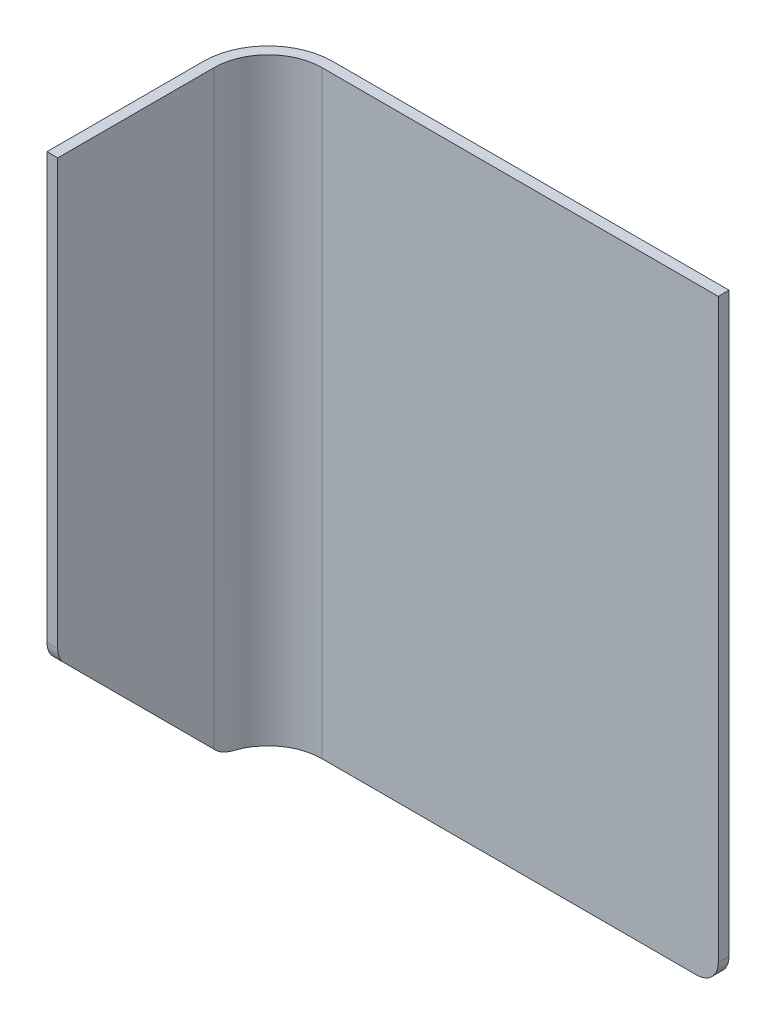
ISO-10303-21;
HEADER;
FILE_DESCRIPTION(('STEP AP214'),'2;1');
FILE_NAME('part.step','',(''),(''),'','','');
FILE_SCHEMA(('AUTOMOTIVE_DESIGN { 1 0 10303 214 1 1 1 1 }'));
ENDSEC;
DATA;
#1=APPLICATION_CONTEXT('core data for automotive mechanical design processes');
#2=APPLICATION_PROTOCOL_DEFINITION('international standard','automotive_design',2000,#1);
#3=PRODUCT_CONTEXT('',#1,'mechanical');
#4=PRODUCT('Part','Part','',(#3));
#5=PRODUCT_RELATED_PRODUCT_CATEGORY('part','',(#4));
#6=PRODUCT_DEFINITION_FORMATION('','',#4);
#7=PRODUCT_DEFINITION_CONTEXT('part definition',#1,'design');
#8=PRODUCT_DEFINITION('design','',#6,#7);
#9=PRODUCT_DEFINITION_SHAPE('','',#8);
#10=(LENGTH_UNIT() NAMED_UNIT(*) SI_UNIT(.MILLI.,.METRE.));
#11=(NAMED_UNIT(*) PLANE_ANGLE_UNIT() SI_UNIT($,.RADIAN.));
#12=(NAMED_UNIT(*) SI_UNIT($,.STERADIAN.) SOLID_ANGLE_UNIT());
#13=UNCERTAINTY_MEASURE_WITH_UNIT(LENGTH_MEASURE(1.E-05),#10,'distance_accuracy_value','');
#14=(GEOMETRIC_REPRESENTATION_CONTEXT(3) GLOBAL_UNCERTAINTY_ASSIGNED_CONTEXT((#13)) GLOBAL_UNIT_ASSIGNED_CONTEXT((#10,
#11,#12)) REPRESENTATION_CONTEXT('',''));
#15=CARTESIAN_POINT('',(0.,0.,0.));
#16=DIRECTION('',(0.,0.,1.));
#17=DIRECTION('',(1.,0.,0.));
#18=AXIS2_PLACEMENT_3D('',#15,#16,#17);
#19=CARTESIAN_POINT('',(-41.6247544353757,-111.,20.0738724011705));
#20=DIRECTION('',(0.,0.,1.));
#21=DIRECTION('',(1.,0.,0.));
#22=AXIS2_PLACEMENT_3D('',#19,#20,#21);
#23=PLANE('',#22);
#24=DIRECTION('',(0.,1.,0.));
#25=VECTOR('',#24,1.);
#26=CARTESIAN_POINT('',(-41.6247544353757,-111.,20.0738724011705));
#27=LINE('',#26,#25);
#28=CARTESIAN_POINT('',(-41.6247544353757,-78.8331457505076,20.0738724011705));
#29=VERTEX_POINT('',#28);
#30=CARTESIAN_POINT('',(-41.6247544353757,0.,20.0738724011705));
#31=VERTEX_POINT('',#30);
#32=EDGE_CURVE('E161',#29,#31,#27,.T.);
#33=ORIENTED_EDGE('',*,*,#32,.F.);
#34=DIRECTION('',(1.,0.,0.));
#35=VECTOR('',#34,1.);
#36=CARTESIAN_POINT('',(-41.6247544353757,-78.8331457505076,20.0738724011705));
#37=LINE('',#36,#35);
#38=CARTESIAN_POINT('',(-39.6247544353757,-78.8331457505076,20.0738724011705));
#39=VERTEX_POINT('',#38);
#40=EDGE_CURVE('E210',#29,#39,#37,.T.);
#41=ORIENTED_EDGE('',*,*,#40,.T.);
#42=DIRECTION('',(0.,1.,0.));
#43=VECTOR('',#42,1.);
#44=CARTESIAN_POINT('',(-39.6247544353757,-111.,20.0738724011705));
#45=LINE('',#44,#43);
#46=CARTESIAN_POINT('',(-39.6247544353757,0.,20.0738724011705));
#47=VERTEX_POINT('',#46);
#48=EDGE_CURVE('E176',#39,#47,#45,.T.);
#49=ORIENTED_EDGE('',*,*,#48,.T.);
#50=DIRECTION('',(1.,0.,0.));
#51=VECTOR('',#50,1.);
#52=CARTESIAN_POINT('',(-41.6247544353757,0.,20.0738724011705));
#53=LINE('',#52,#51);
#54=EDGE_CURVE('E155',#31,#47,#53,.T.);
#55=ORIENTED_EDGE('',*,*,#54,.F.);
#56=EDGE_LOOP('',(#33,#41,#49,#55));
#57=FACE_BOUND('',#56,.T.);
#58=ADVANCED_FACE('F45',(#57),#23,.T.);
#59=CARTESIAN_POINT('',(-41.6247544353757,-111.,-8.92612759882961));
#60=DIRECTION('',(-1.,0.,0.));
#61=DIRECTION('',(0.,0.,1.));
#62=AXIS2_PLACEMENT_3D('',#59,#60,#61);
#63=PLANE('',#62);
#64=DIRECTION('',(0.,0.707106781186545,0.70710678118655));
#65=VECTOR('',#64,1.);
#66=CARTESIAN_POINT('',(-41.6247544353757,-110.245,-9.68112759882964));
#67=LINE('',#66,#65);
#68=CARTESIAN_POINT('',(-41.6247544353757,-109.49,-8.92612759882961));
#69=VERTEX_POINT('',#68);
#70=CARTESIAN_POINT('',(-41.6247544353757,-81.6615728752538,18.9022995259167));
#71=VERTEX_POINT('',#70);
#72=EDGE_CURVE('E145',#69,#71,#67,.T.);
#73=ORIENTED_EDGE('',*,*,#72,.T.);
#74=CARTESIAN_POINT('',(-41.6247544353757,-78.8331457505076,16.0738724011705));
#75=DIRECTION('',(-1.,0.,0.));
#76=DIRECTION('',(0.,0.,1.));
#77=AXIS2_PLACEMENT_3D('',#74,#75,#76);
#78=CIRCLE('',#77,4.);
#79=EDGE_CURVE('E248',#71,#29,#78,.T.);
#80=ORIENTED_EDGE('',*,*,#79,.T.);
#81=ORIENTED_EDGE('',*,*,#32,.T.);
#82=DIRECTION('',(0.,0.,1.));
#83=VECTOR('',#82,1.);
#84=CARTESIAN_POINT('',(-41.6247544353757,0.,-8.92612759882961));
#85=LINE('',#84,#83);
#86=CARTESIAN_POINT('',(-41.6247544353757,0.,-8.92612759882961));
#87=VERTEX_POINT('',#86);
#88=EDGE_CURVE('E160',#87,#31,#85,.T.);
#89=ORIENTED_EDGE('',*,*,#88,.F.);
#90=DIRECTION('',(0.,1.,0.));
#91=VECTOR('',#90,1.);
#92=CARTESIAN_POINT('',(-41.6247544353757,-111.,-8.92612759882961));
#93=LINE('',#92,#91);
#94=EDGE_CURVE('E138',#69,#87,#93,.T.);
#95=ORIENTED_EDGE('',*,*,#94,.F.);
#96=EDGE_LOOP('',(#73,#80,#81,#89,#95));
#97=FACE_BOUND('',#96,.T.);
#98=ADVANCED_FACE('F158',(#97),#63,.T.);
#99=CARTESIAN_POINT('',(-29.6247544353757,-111.,-8.92612759882969));
#100=DIRECTION('',(0.,1.,0.));
#101=DIRECTION('',(0.,0.,1.));
#102=AXIS2_PLACEMENT_3D('',#99,#100,#101);
#103=CYLINDRICAL_SURFACE('',#102,12.);
#104=CARTESIAN_POINT('',(-29.6247544353757,-111.,-8.92612759882969));
#105=DIRECTION('',(0.,1.,0.));
#106=DIRECTION('',(0.,0.,-1.));
#107=AXIS2_PLACEMENT_3D('',#104,#105,#106);
#108=CIRCLE('',#107,12.);
#109=CARTESIAN_POINT('',(-29.6247544353756,-111.,-20.9261275988297));
#110=VERTEX_POINT('',#109);
#111=CARTESIAN_POINT('',(-41.1993401369234,-111.,-12.092981848322));
#112=VERTEX_POINT('',#111);
#113=EDGE_CURVE('E178',#110,#112,#108,.T.);
#114=ORIENTED_EDGE('',*,*,#113,.T.);
#115=CARTESIAN_POINT('',(-41.1993401369234,-111.,-12.092981848322));
#116=CARTESIAN_POINT('',(-41.2282799753824,-111.00001372111,-11.9872615264532));
#117=CARTESIAN_POINT('',(-41.2557481150244,-110.995808945441,-11.8811265743544));
#118=CARTESIAN_POINT('',(-41.3076374854076,-110.978864870066,-11.668773031291));
#119=CARTESIAN_POINT('',(-41.3320581278192,-110.966123925438,-11.562554428148));
#120=CARTESIAN_POINT('',(-41.3777403307654,-110.932007976302,-11.350808598872));
#121=CARTESIAN_POINT('',(-41.399001534314,-110.91063199713,-11.2452814521526));
#122=CARTESIAN_POINT('',(-41.4383411267961,-110.859261790802,-11.0357542865077));
#123=CARTESIAN_POINT('',(-41.4564198857218,-110.829268566558,-10.9317540913484));
#124=CARTESIAN_POINT('',(-41.4894801216575,-110.760701232352,-10.725898213813));
#125=CARTESIAN_POINT('',(-41.504455846915,-110.722111457739,-10.6240468226912));
#126=CARTESIAN_POINT('',(-41.531395812914,-110.636580513832,-10.423501275668));
#127=CARTESIAN_POINT('',(-41.5433600615644,-110.589639366472,-10.3248071114754));
#128=CARTESIAN_POINT('',(-41.5644566853485,-110.487771614103,-10.131511315448));
#129=CARTESIAN_POINT('',(-41.5735933614537,-110.432857325712,-10.0369036582086));
#130=CARTESIAN_POINT('',(-41.5893105059684,-110.315376236281,-9.85239344731122));
#131=CARTESIAN_POINT('',(-41.595892040973,-110.25281264267,-9.76248894400074));
#132=CARTESIAN_POINT('',(-41.6058779905045,-110.131689335304,-9.60284411934305));
#133=CARTESIAN_POINT('',(-41.6096319986706,-110.07425136263,-9.53227070650089));
#134=CARTESIAN_POINT('',(-41.6157770091754,-109.954750121988,-9.3952577587262));
#135=CARTESIAN_POINT('',(-41.6181698234536,-109.892693127685,-9.32881283371053));
#136=CARTESIAN_POINT('',(-41.6199812811355,-109.828427124746,-9.26455472357586));
#137=B_SPLINE_CURVE_WITH_KNOTS('',3,(#115,#116,#117,#118,#119,#120,#121,#122,#123,#124,#125,
#126,#127,#128,#129,#130,#131,#132,#133,#134,#135,#136),.UNSPECIFIED.,.F.,.F.,(4,2,2,2,2,2,2,2,
2,2,4),(0.,0.328754857572508,0.657573084517313,0.986428436538706,1.31524553042979,
1.64466676915633,1.97408714271983,2.30300394950849,2.63178330821751,2.90477859024877,
3.17740962189189),.UNSPECIFIED.);
#138=CARTESIAN_POINT('',(-41.6199812811355,-109.828427124746,-9.26455472357586));
#139=VERTEX_POINT('',#138);
#140=EDGE_CURVE('E141',#112,#139,#137,.T.);
#141=ORIENTED_EDGE('',*,*,#140,.T.);
#142=CARTESIAN_POINT('',(-29.6247544353757,-109.49,-8.92612759882969));
#143=DIRECTION('',(0.,-0.70710678118655,0.707106781186545));
#144=DIRECTION('',(0.,0.707106781186545,0.70710678118655));
#145=AXIS2_PLACEMENT_3D('',#142,#143,#144);
#146=ELLIPSE('',#145,16.9705627484771,12.);
#147=EDGE_CURVE('E132',#139,#69,#146,.F.);
#148=ORIENTED_EDGE('',*,*,#147,.T.);
#149=ORIENTED_EDGE('',*,*,#94,.T.);
#150=CARTESIAN_POINT('',(-29.6247544353757,0.,-8.92612759882969));
#151=DIRECTION('',(0.,1.,0.));
#152=DIRECTION('',(0.,0.,-1.));
#153=AXIS2_PLACEMENT_3D('',#150,#151,#152);
#154=CIRCLE('',#153,12.);
#155=CARTESIAN_POINT('',(-29.6247544353756,0.,-20.9261275988297));
#156=VERTEX_POINT('',#155);
#157=EDGE_CURVE('E294',#156,#87,#154,.T.);
#158=ORIENTED_EDGE('',*,*,#157,.F.);
#159=DIRECTION('',(0.,1.,0.));
#160=VECTOR('',#159,1.);
#161=CARTESIAN_POINT('',(-29.6247544353756,-111.,-20.9261275988297));
#162=LINE('',#161,#160);
#163=EDGE_CURVE('E162',#110,#156,#162,.T.);
#164=ORIENTED_EDGE('',*,*,#163,.F.);
#165=EDGE_LOOP('',(#114,#141,#148,#149,#158,#164));
#166=FACE_BOUND('',#165,.T.);
#167=ADVANCED_FACE('F135',(#166),#103,.T.);
#168=CARTESIAN_POINT('',(-29.6247544353757,-111.,-8.9261275988295));
#169=DIRECTION('',(0.,1.,0.));
#170=DIRECTION('',(0.,0.,1.));
#171=AXIS2_PLACEMENT_3D('',#168,#169,#170);
#172=CYLINDRICAL_SURFACE('',#171,10.);
#173=CARTESIAN_POINT('',(-29.6247544353757,-109.49,-8.9261275988295));
#174=DIRECTION('',(0.,-0.70710678118655,0.707106781186545));
#175=DIRECTION('',(0.,0.707106781186545,0.70710678118655));
#176=AXIS2_PLACEMENT_3D('',#173,#174,#175);
#177=ELLIPSE('',#176,14.1421356237309,10.);
#178=CARTESIAN_POINT('',(-39.6247544353757,-109.49,-8.9261275988295));
#179=VERTEX_POINT('',#178);
#180=CARTESIAN_POINT('',(-39.6190261487742,-109.828427124746,-9.26455472357587));
#181=VERTEX_POINT('',#180);
#182=EDGE_CURVE('E146',#179,#181,#177,.T.);
#183=ORIENTED_EDGE('',*,*,#182,.T.);
#184=CARTESIAN_POINT('',(-39.6190261487742,-109.828427124746,-9.26455472357586));
#185=CARTESIAN_POINT('',(-39.616455337591,-109.904502174434,-9.34060961446741));
#186=CARTESIAN_POINT('',(-39.6129024704812,-109.977476431441,-9.4197400643351));
#187=CARTESIAN_POINT('',(-39.6034573271443,-110.11676811878,-9.58354253513354));
#188=CARTESIAN_POINT('',(-39.5975647724914,-110.18308475567,-9.66821521459471));
#189=CARTESIAN_POINT('',(-39.5830717129552,-110.308532902497,-9.84239820898313));
#190=CARTESIAN_POINT('',(-39.574473574206,-110.367670628274,-9.93190424052009));
#191=CARTESIAN_POINT('',(-39.5542459552563,-110.478432511618,-10.1151137209735));
#192=CARTESIAN_POINT('',(-39.5426167591666,-110.530057372685,-10.208816775808));
#193=CARTESIAN_POINT('',(-39.5160381610993,-110.625559537062,-10.399836943561));
#194=CARTESIAN_POINT('',(-39.501083272186,-110.669423819217,-10.497159805095));
#195=CARTESIAN_POINT('',(-39.4676684494102,-110.749066537769,-10.6944757827137));
#196=CARTESIAN_POINT('',(-39.4492085027898,-110.784844944734,-10.7944689085166));
#197=CARTESIAN_POINT('',(-39.4086883830778,-110.848147467861,-10.9962021461832));
#198=CARTESIAN_POINT('',(-39.3866319113439,-110.875679988488,-11.097940366767));
#199=CARTESIAN_POINT('',(-39.3388823423748,-110.922499450851,-11.302414909108));
#200=CARTESIAN_POINT('',(-39.3131905124794,-110.941789256739,-11.4051508714617));
#201=CARTESIAN_POINT('',(-39.2595718339454,-110.971447609884,-11.6057770538249));
#202=CARTESIAN_POINT('',(-39.2318181189981,-110.982209832121,-11.7036559113759));
#203=CARTESIAN_POINT('',(-39.1732269790874,-110.996485667768,-11.8988542085061));
#204=CARTESIAN_POINT('',(-39.142394400131,-111.000010489705,-11.9961742799953));
#205=CARTESIAN_POINT('',(-39.110060659345,-111.,-12.092981848322));
#206=B_SPLINE_CURVE_WITH_KNOTS('',3,(#184,#185,#186,#187,#188,#189,#190,#191,#192,#193,#194,
#195,#196,#197,#198,#199,#200,#201,#202,#203,#204,#205),.UNSPECIFIED.,.F.,.F.,(4,2,2,2,2,2,2,2,
2,2,4),(0.,0.322724533026025,0.645487482194528,0.967968943975678,1.29042018939091,
1.61340743487334,1.93639585601089,2.25905394813892,2.58159983273217,2.88821016331266,
3.19434528867764),.UNSPECIFIED.);
#207=CARTESIAN_POINT('',(-39.110060659345,-111.,-12.092981848322));
#208=VERTEX_POINT('',#207);
#209=EDGE_CURVE('E182',#181,#208,#206,.T.);
#210=ORIENTED_EDGE('',*,*,#209,.T.);
#211=CARTESIAN_POINT('',(-29.6247544353757,-111.,-8.9261275988295));
#212=DIRECTION('',(0.,-1.,0.));
#213=DIRECTION('',(0.,0.,-1.));
#214=AXIS2_PLACEMENT_3D('',#211,#212,#213);
#215=CIRCLE('',#214,10.);
#216=CARTESIAN_POINT('',(-29.6247544353757,-111.,-18.9261275988295));
#217=VERTEX_POINT('',#216);
#218=EDGE_CURVE('E265',#208,#217,#215,.T.);
#219=ORIENTED_EDGE('',*,*,#218,.T.);
#220=DIRECTION('',(0.,1.,0.));
#221=VECTOR('',#220,1.);
#222=CARTESIAN_POINT('',(-29.6247544353757,-111.,-18.9261275988295));
#223=LINE('',#222,#221);
#224=CARTESIAN_POINT('',(-29.6247544353757,0.,-18.9261275988295));
#225=VERTEX_POINT('',#224);
#226=EDGE_CURVE('E172',#217,#225,#223,.T.);
#227=ORIENTED_EDGE('',*,*,#226,.T.);
#228=CARTESIAN_POINT('',(-29.6247544353757,0.,-8.9261275988295));
#229=DIRECTION('',(0.,-1.,0.));
#230=DIRECTION('',(0.,0.,-1.));
#231=AXIS2_PLACEMENT_3D('',#228,#229,#230);
#232=CIRCLE('',#231,10.);
#233=CARTESIAN_POINT('',(-39.6247544353757,0.,-8.9261275988295));
#234=VERTEX_POINT('',#233);
#235=EDGE_CURVE('E282',#234,#225,#232,.T.);
#236=ORIENTED_EDGE('',*,*,#235,.F.);
#237=DIRECTION('',(0.,1.,0.));
#238=VECTOR('',#237,1.);
#239=CARTESIAN_POINT('',(-39.6247544353757,-111.,-8.9261275988295));
#240=LINE('',#239,#238);
#241=EDGE_CURVE('E174',#179,#234,#240,.T.);
#242=ORIENTED_EDGE('',*,*,#241,.F.);
#243=EDGE_LOOP('',(#183,#210,#219,#227,#236,#242));
#244=FACE_BOUND('',#243,.T.);
#245=ADVANCED_FACE('F192',(#244),#172,.F.);
#246=CARTESIAN_POINT('',(-39.6247544353757,-111.,20.0738724011705));
#247=DIRECTION('',(1.,0.,0.));
#248=DIRECTION('',(0.,0.,-1.));
#249=AXIS2_PLACEMENT_3D('',#246,#247,#248);
#250=PLANE('',#249);
#251=ORIENTED_EDGE('',*,*,#48,.F.);
#252=CARTESIAN_POINT('',(-39.6247544353757,-78.8331457505076,16.0738724011705));
#253=DIRECTION('',(1.,0.,0.));
#254=DIRECTION('',(0.,0.,-1.));
#255=AXIS2_PLACEMENT_3D('',#252,#253,#254);
#256=CIRCLE('',#255,4.);
#257=CARTESIAN_POINT('',(-39.6247544353757,-81.6615728752538,18.9022995259167));
#258=VERTEX_POINT('',#257);
#259=EDGE_CURVE('E249',#39,#258,#256,.T.);
#260=ORIENTED_EDGE('',*,*,#259,.T.);
#261=DIRECTION('',(0.,-0.707106781186545,-0.70710678118655));
#262=VECTOR('',#261,1.);
#263=CARTESIAN_POINT('',(-39.6247544353757,-95.7449999999999,4.8188724011705));
#264=LINE('',#263,#262);
#265=EDGE_CURVE('E272',#258,#179,#264,.T.);
#266=ORIENTED_EDGE('',*,*,#265,.T.);
#267=ORIENTED_EDGE('',*,*,#241,.T.);
#268=DIRECTION('',(0.,0.,-1.));
#269=VECTOR('',#268,1.);
#270=CARTESIAN_POINT('',(-39.6247544353757,0.,20.0738724011705));
#271=LINE('',#270,#269);
#272=EDGE_CURVE('E279',#47,#234,#271,.T.);
#273=ORIENTED_EDGE('',*,*,#272,.F.);
#274=EDGE_LOOP('',(#251,#260,#266,#267,#273));
#275=FACE_BOUND('',#274,.T.);
#276=ADVANCED_FACE('F222',(#275),#250,.T.);
#277=CARTESIAN_POINT('',(43.8752455646243,-111.,-20.9261275988296));
#278=DIRECTION('',(0.,0.,-1.));
#279=DIRECTION('',(-1.,0.,0.));
#280=AXIS2_PLACEMENT_3D('',#277,#278,#279);
#281=PLANE('',#280);
#282=DIRECTION('',(0.,1.,0.));
#283=VECTOR('',#282,1.);
#284=CARTESIAN_POINT('',(43.8752455646243,-111.,-20.9261275988296));
#285=LINE('',#284,#283);
#286=CARTESIAN_POINT('',(43.8752455646243,-107.,-20.9261275988296));
#287=VERTEX_POINT('',#286);
#288=CARTESIAN_POINT('',(43.8752455646243,0.,-20.9261275988296));
#289=VERTEX_POINT('',#288);
#290=EDGE_CURVE('E165',#287,#289,#285,.T.);
#291=ORIENTED_EDGE('',*,*,#290,.F.);
#292=CARTESIAN_POINT('',(39.8752455646243,-107.,-20.9261275988296));
#293=DIRECTION('',(0.,0.,-1.));
#294=DIRECTION('',(-1.,0.,0.));
#295=AXIS2_PLACEMENT_3D('',#292,#293,#294);
#296=CIRCLE('',#295,4.);
#297=CARTESIAN_POINT('',(39.8752455646243,-111.,-20.9261275988296));
#298=VERTEX_POINT('',#297);
#299=EDGE_CURVE('E53',#287,#298,#296,.T.);
#300=ORIENTED_EDGE('',*,*,#299,.T.);
#301=DIRECTION('',(-1.,0.,0.));
#302=VECTOR('',#301,1.);
#303=CARTESIAN_POINT('',(43.8752455646243,-111.,-20.9261275988296));
#304=LINE('',#303,#302);
#305=EDGE_CURVE('E256',#298,#110,#304,.T.);
#306=ORIENTED_EDGE('',*,*,#305,.T.);
#307=ORIENTED_EDGE('',*,*,#163,.T.);
#308=DIRECTION('',(-1.,0.,0.));
#309=VECTOR('',#308,1.);
#310=CARTESIAN_POINT('',(43.8752455646243,0.,-20.9261275988296));
#311=LINE('',#310,#309);
#312=EDGE_CURVE('E291',#289,#156,#311,.T.);
#313=ORIENTED_EDGE('',*,*,#312,.F.);
#314=EDGE_LOOP('',(#291,#300,#306,#307,#313));
#315=FACE_BOUND('',#314,.T.);
#316=ADVANCED_FACE('F218',(#315),#281,.T.);
#317=CARTESIAN_POINT('',(43.8752455646243,-111.,-20.9261275988296));
#318=DIRECTION('',(1.,0.,0.));
#319=DIRECTION('',(0.,0.,-1.));
#320=AXIS2_PLACEMENT_3D('',#317,#318,#319);
#321=PLANE('',#320);
#322=DIRECTION('',(0.,1.,0.));
#323=VECTOR('',#322,1.);
#324=CARTESIAN_POINT('',(43.8752455646243,-111.,-18.9261275988295));
#325=LINE('',#324,#323);
#326=CARTESIAN_POINT('',(43.8752455646243,-107.,-18.9261275988295));
#327=VERTEX_POINT('',#326);
#328=CARTESIAN_POINT('',(43.8752455646243,0.,-18.9261275988295));
#329=VERTEX_POINT('',#328);
#330=EDGE_CURVE('E170',#327,#329,#325,.T.);
#331=ORIENTED_EDGE('',*,*,#330,.F.);
#332=DIRECTION('',(0.,0.,-1.));
#333=VECTOR('',#332,1.);
#334=CARTESIAN_POINT('',(43.8752455646243,-107.,-20.9261275988296));
#335=LINE('',#334,#333);
#336=EDGE_CURVE('E251',#327,#287,#335,.T.);
#337=ORIENTED_EDGE('',*,*,#336,.T.);
#338=ORIENTED_EDGE('',*,*,#290,.T.);
#339=DIRECTION('',(0.,0.,-1.));
#340=VECTOR('',#339,1.);
#341=CARTESIAN_POINT('',(43.8752455646243,0.,-20.9261275988296));
#342=LINE('',#341,#340);
#343=EDGE_CURVE('E288',#329,#289,#342,.T.);
#344=ORIENTED_EDGE('',*,*,#343,.F.);
#345=EDGE_LOOP('',(#331,#337,#338,#344));
#346=FACE_BOUND('',#345,.T.);
#347=ADVANCED_FACE('F221',(#346),#321,.T.);
#348=CARTESIAN_POINT('',(-29.6247544353757,-111.,-18.9261275988295));
#349=DIRECTION('',(0.,0.,1.));
#350=DIRECTION('',(1.,0.,0.));
#351=AXIS2_PLACEMENT_3D('',#348,#349,#350);
#352=PLANE('',#351);
#353=DIRECTION('',(1.,0.,0.));
#354=VECTOR('',#353,1.);
#355=CARTESIAN_POINT('',(-29.6247544353757,-111.,-18.9261275988295));
#356=LINE('',#355,#354);
#357=CARTESIAN_POINT('',(39.8752455646243,-111.,-18.9261275988295));
#358=VERTEX_POINT('',#357);
#359=EDGE_CURVE('E262',#217,#358,#356,.T.);
#360=ORIENTED_EDGE('',*,*,#359,.T.);
#361=CARTESIAN_POINT('',(39.8752455646243,-107.,-18.9261275988295));
#362=DIRECTION('',(0.,0.,1.));
#363=DIRECTION('',(1.,0.,0.));
#364=AXIS2_PLACEMENT_3D('',#361,#362,#363);
#365=CIRCLE('',#364,4.);
#366=EDGE_CURVE('E11',#358,#327,#365,.T.);
#367=ORIENTED_EDGE('',*,*,#366,.T.);
#368=ORIENTED_EDGE('',*,*,#330,.T.);
#369=DIRECTION('',(1.,0.,0.));
#370=VECTOR('',#369,1.);
#371=CARTESIAN_POINT('',(-29.6247544353757,0.,-18.9261275988295));
#372=LINE('',#371,#370);
#373=EDGE_CURVE('E285',#225,#329,#372,.T.);
#374=ORIENTED_EDGE('',*,*,#373,.F.);
#375=ORIENTED_EDGE('',*,*,#226,.F.);
#376=EDGE_LOOP('',(#360,#367,#368,#374,#375));
#377=FACE_BOUND('',#376,.T.);
#378=ADVANCED_FACE('F225',(#377),#352,.T.);
#379=CARTESIAN_POINT('',(-29.6247544353757,-111.,-8.9261275988295));
#380=DIRECTION('',(0.,-1.,0.));
#381=DIRECTION('',(0.,0.,-1.));
#382=AXIS2_PLACEMENT_3D('',#379,#380,#381);
#383=PLANE('',#382);
#384=ORIENTED_EDGE('',*,*,#218,.F.);
#385=DIRECTION('',(1.,0.,0.));
#386=VECTOR('',#385,1.);
#387=CARTESIAN_POINT('',(-29.6247544353757,-111.,-12.092981848322));
#388=LINE('',#387,#386);
#389=EDGE_CURVE('E211',#208,#112,#388,.F.);
#390=ORIENTED_EDGE('',*,*,#389,.T.);
#391=ORIENTED_EDGE('',*,*,#113,.F.);
#392=ORIENTED_EDGE('',*,*,#305,.F.);
#393=DIRECTION('',(0.,0.,-1.));
#394=VECTOR('',#393,1.);
#395=CARTESIAN_POINT('',(39.8752455646243,-111.,-8.9261275988295));
#396=LINE('',#395,#394);
#397=EDGE_CURVE('E190',#298,#358,#396,.F.);
#398=ORIENTED_EDGE('',*,*,#397,.T.);
#399=ORIENTED_EDGE('',*,*,#359,.F.);
#400=EDGE_LOOP('',(#384,#390,#391,#392,#398,#399));
#401=FACE_BOUND('',#400,.T.);
#402=ADVANCED_FACE('F228',(#401),#383,.T.);
#403=CARTESIAN_POINT('',(-29.6247544353757,0.,-8.9261275988295));
#404=DIRECTION('',(0.,-1.,0.));
#405=DIRECTION('',(0.,0.,-1.));
#406=AXIS2_PLACEMENT_3D('',#403,#404,#405);
#407=PLANE('',#406);
#408=ORIENTED_EDGE('',*,*,#54,.T.);
#409=ORIENTED_EDGE('',*,*,#272,.T.);
#410=ORIENTED_EDGE('',*,*,#235,.T.);
#411=ORIENTED_EDGE('',*,*,#373,.T.);
#412=ORIENTED_EDGE('',*,*,#343,.T.);
#413=ORIENTED_EDGE('',*,*,#312,.T.);
#414=ORIENTED_EDGE('',*,*,#157,.T.);
#415=ORIENTED_EDGE('',*,*,#88,.T.);
#416=EDGE_LOOP('',(#408,#409,#410,#411,#412,#413,#414,#415));
#417=FACE_BOUND('',#416,.T.);
#418=ADVANCED_FACE('F232',(#417),#407,.F.);
#419=CARTESIAN_POINT('',(-224.108700647091,-80.49,20.0738724011705));
#420=DIRECTION('',(0.,-0.70710678118655,0.707106781186545));
#421=DIRECTION('',(0.,-0.707106781186545,-0.70710678118655));
#422=AXIS2_PLACEMENT_3D('',#419,#420,#421);
#423=PLANE('',#422);
#424=ORIENTED_EDGE('',*,*,#147,.F.);
#425=DIRECTION('',(1.,0.,0.));
#426=VECTOR('',#425,1.);
#427=CARTESIAN_POINT('',(-224.108700647091,-109.828427124746,-9.26455472357582));
#428=LINE('',#427,#426);
#429=EDGE_CURVE('E180',#139,#181,#428,.T.);
#430=ORIENTED_EDGE('',*,*,#429,.T.);
#431=ORIENTED_EDGE('',*,*,#182,.F.);
#432=ORIENTED_EDGE('',*,*,#265,.F.);
#433=DIRECTION('',(1.,0.,0.));
#434=VECTOR('',#433,1.);
#435=CARTESIAN_POINT('',(-224.108700647091,-81.6615728752539,18.9022995259167));
#436=LINE('',#435,#434);
#437=EDGE_CURVE('E152',#258,#71,#436,.F.);
#438=ORIENTED_EDGE('',*,*,#437,.T.);
#439=ORIENTED_EDGE('',*,*,#72,.F.);
#440=EDGE_LOOP('',(#424,#430,#431,#432,#438,#439));
#441=FACE_BOUND('',#440,.T.);
#442=ADVANCED_FACE('F149',(#441),#423,.T.);
#443=CARTESIAN_POINT('',(-224.108700647091,-107.,-12.092981848322));
#444=DIRECTION('',(1.,0.,0.));
#445=DIRECTION('',(0.,0.,-1.));
#446=AXIS2_PLACEMENT_3D('',#443,#444,#445);
#447=CYLINDRICAL_SURFACE('',#446,4.);
#448=ORIENTED_EDGE('',*,*,#140,.F.);
#449=ORIENTED_EDGE('',*,*,#389,.F.);
#450=ORIENTED_EDGE('',*,*,#209,.F.);
#451=ORIENTED_EDGE('',*,*,#429,.F.);
#452=EDGE_LOOP('',(#448,#449,#450,#451));
#453=FACE_BOUND('',#452,.T.);
#454=ADVANCED_FACE('F196',(#453),#447,.T.);
#455=CARTESIAN_POINT('',(-41.6247544353757,-78.8331457505076,16.0738724011705));
#456=DIRECTION('',(1.,0.,0.));
#457=DIRECTION('',(0.,1.,0.));
#458=AXIS2_PLACEMENT_3D('',#455,#456,#457);
#459=CYLINDRICAL_SURFACE('',#458,4.);
#460=ORIENTED_EDGE('',*,*,#79,.F.);
#461=ORIENTED_EDGE('',*,*,#437,.F.);
#462=ORIENTED_EDGE('',*,*,#259,.F.);
#463=ORIENTED_EDGE('',*,*,#40,.F.);
#464=EDGE_LOOP('',(#460,#461,#462,#463));
#465=FACE_BOUND('',#464,.T.);
#466=ADVANCED_FACE('F200',(#465),#459,.T.);
#467=CARTESIAN_POINT('',(39.8752455646243,-107.,-20.9261275988296));
#468=DIRECTION('',(0.,0.,-1.));
#469=DIRECTION('',(-1.,0.,0.));
#470=AXIS2_PLACEMENT_3D('',#467,#468,#469);
#471=CYLINDRICAL_SURFACE('',#470,4.);
#472=ORIENTED_EDGE('',*,*,#366,.F.);
#473=ORIENTED_EDGE('',*,*,#397,.F.);
#474=ORIENTED_EDGE('',*,*,#299,.F.);
#475=ORIENTED_EDGE('',*,*,#336,.F.);
#476=EDGE_LOOP('',(#472,#473,#474,#475));
#477=FACE_BOUND('',#476,.T.);
#478=ADVANCED_FACE('F47',(#477),#471,.T.);
#479=CLOSED_SHELL('',(#58,#98,#167,#245,#276,#316,#347,#378,#402,#418,#442,#454,#466,#478));
#480=MANIFOLD_SOLID_BREP('B2',#479);
#481=ADVANCED_BREP_SHAPE_REPRESENTATION('',(#18,#480),#14);
#482=SHAPE_DEFINITION_REPRESENTATION(#9,#481);
ENDSEC;
END-ISO-10303-21;
